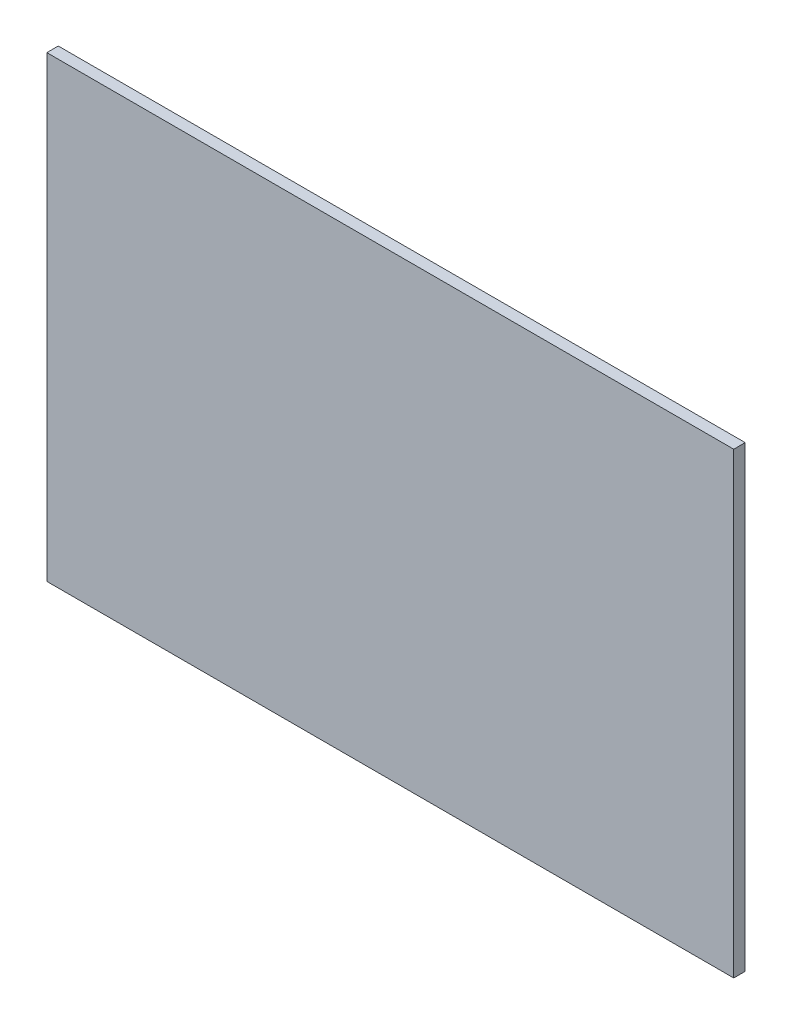
ISO-10303-21;
HEADER;
FILE_DESCRIPTION(('STEP AP214'),'2;1');
FILE_NAME('part.step','',(''),(''),'','','');
FILE_SCHEMA(('AUTOMOTIVE_DESIGN { 1 0 10303 214 1 1 1 1 }'));
ENDSEC;
DATA;
#1=APPLICATION_CONTEXT('core data for automotive mechanical design processes');
#2=APPLICATION_PROTOCOL_DEFINITION('international standard','automotive_design',2000,#1);
#3=PRODUCT_CONTEXT('',#1,'mechanical');
#4=PRODUCT('Part','Part','',(#3));
#5=PRODUCT_RELATED_PRODUCT_CATEGORY('part','',(#4));
#6=PRODUCT_DEFINITION_FORMATION('','',#4);
#7=PRODUCT_DEFINITION_CONTEXT('part definition',#1,'design');
#8=PRODUCT_DEFINITION('design','',#6,#7);
#9=PRODUCT_DEFINITION_SHAPE('','',#8);
#10=(LENGTH_UNIT() NAMED_UNIT(*) SI_UNIT(.MILLI.,.METRE.));
#11=(NAMED_UNIT(*) PLANE_ANGLE_UNIT() SI_UNIT($,.RADIAN.));
#12=(NAMED_UNIT(*) SI_UNIT($,.STERADIAN.) SOLID_ANGLE_UNIT());
#13=UNCERTAINTY_MEASURE_WITH_UNIT(LENGTH_MEASURE(1.E-05),#10,'distance_accuracy_value','');
#14=(GEOMETRIC_REPRESENTATION_CONTEXT(3) GLOBAL_UNCERTAINTY_ASSIGNED_CONTEXT((#13)) GLOBAL_UNIT_ASSIGNED_CONTEXT((#10,
#11,#12)) REPRESENTATION_CONTEXT('',''));
#15=CARTESIAN_POINT('',(0.,0.,0.));
#16=DIRECTION('',(0.,0.,1.));
#17=DIRECTION('',(1.,0.,0.));
#18=AXIS2_PLACEMENT_3D('',#15,#16,#17);
#19=CARTESIAN_POINT('',(0.,0.,10.));
#20=DIRECTION('',(0.,1.,0.));
#21=DIRECTION('',(0.,0.,1.));
#22=AXIS2_PLACEMENT_3D('',#19,#20,#21);
#23=PLANE('',#22);
#24=DIRECTION('',(1.,0.,0.));
#25=VECTOR('',#24,1.);
#26=CARTESIAN_POINT('',(0.,0.,0.));
#27=LINE('',#26,#25);
#28=CARTESIAN_POINT('',(0.,0.,0.));
#29=VERTEX_POINT('',#28);
#30=CARTESIAN_POINT('',(600.,0.,0.));
#31=VERTEX_POINT('',#30);
#32=EDGE_CURVE('E111',#29,#31,#27,.T.);
#33=ORIENTED_EDGE('',*,*,#32,.T.);
#34=DIRECTION('',(0.,0.,-1.));
#35=VECTOR('',#34,1.);
#36=CARTESIAN_POINT('',(600.,0.,10.));
#37=LINE('',#36,#35);
#38=CARTESIAN_POINT('',(600.,0.,10.));
#39=VERTEX_POINT('',#38);
#40=EDGE_CURVE('E11',#39,#31,#37,.T.);
#41=ORIENTED_EDGE('',*,*,#40,.F.);
#42=DIRECTION('',(1.,0.,0.));
#43=VECTOR('',#42,1.);
#44=CARTESIAN_POINT('',(0.,0.,10.));
#45=LINE('',#44,#43);
#46=CARTESIAN_POINT('',(0.,0.,10.));
#47=VERTEX_POINT('',#46);
#48=EDGE_CURVE('E93',#47,#39,#45,.T.);
#49=ORIENTED_EDGE('',*,*,#48,.F.);
#50=DIRECTION('',(0.,0.,-1.));
#51=VECTOR('',#50,1.);
#52=CARTESIAN_POINT('',(0.,0.,10.));
#53=LINE('',#52,#51);
#54=EDGE_CURVE('E60',#47,#29,#53,.T.);
#55=ORIENTED_EDGE('',*,*,#54,.T.);
#56=EDGE_LOOP('',(#33,#41,#49,#55));
#57=FACE_BOUND('',#56,.T.);
#58=ADVANCED_FACE('F43',(#57),#23,.F.);
#59=CARTESIAN_POINT('',(600.,0.,10.));
#60=DIRECTION('',(-1.,0.,0.));
#61=DIRECTION('',(0.,0.,1.));
#62=AXIS2_PLACEMENT_3D('',#59,#60,#61);
#63=PLANE('',#62);
#64=DIRECTION('',(0.,1.,0.));
#65=VECTOR('',#64,1.);
#66=CARTESIAN_POINT('',(600.,0.,0.));
#67=LINE('',#66,#65);
#68=CARTESIAN_POINT('',(600.,400.,0.));
#69=VERTEX_POINT('',#68);
#70=EDGE_CURVE('E99',#31,#69,#67,.T.);
#71=ORIENTED_EDGE('',*,*,#70,.T.);
#72=DIRECTION('',(0.,0.,-1.));
#73=VECTOR('',#72,1.);
#74=CARTESIAN_POINT('',(600.,400.,10.));
#75=LINE('',#74,#73);
#76=CARTESIAN_POINT('',(600.,400.,10.));
#77=VERTEX_POINT('',#76);
#78=EDGE_CURVE('E52',#77,#69,#75,.T.);
#79=ORIENTED_EDGE('',*,*,#78,.F.);
#80=DIRECTION('',(0.,1.,0.));
#81=VECTOR('',#80,1.);
#82=CARTESIAN_POINT('',(600.,0.,10.));
#83=LINE('',#82,#81);
#84=EDGE_CURVE('E85',#39,#77,#83,.T.);
#85=ORIENTED_EDGE('',*,*,#84,.F.);
#86=ORIENTED_EDGE('',*,*,#40,.T.);
#87=EDGE_LOOP('',(#71,#79,#85,#86));
#88=FACE_BOUND('',#87,.T.);
#89=ADVANCED_FACE('F98',(#88),#63,.F.);
#90=CARTESIAN_POINT('',(0.,400.,10.));
#91=DIRECTION('',(0.,1.,0.));
#92=DIRECTION('',(0.,0.,1.));
#93=AXIS2_PLACEMENT_3D('',#90,#91,#92);
#94=PLANE('',#93);
#95=DIRECTION('',(1.,0.,0.));
#96=VECTOR('',#95,1.);
#97=CARTESIAN_POINT('',(0.,400.,0.));
#98=LINE('',#97,#96);
#99=CARTESIAN_POINT('',(0.,400.,0.));
#100=VERTEX_POINT('',#99);
#101=EDGE_CURVE('E116',#100,#69,#98,.T.);
#102=ORIENTED_EDGE('',*,*,#101,.F.);
#103=DIRECTION('',(0.,0.,-1.));
#104=VECTOR('',#103,1.);
#105=CARTESIAN_POINT('',(0.,400.,10.));
#106=LINE('',#105,#104);
#107=CARTESIAN_POINT('',(0.,400.,10.));
#108=VERTEX_POINT('',#107);
#109=EDGE_CURVE('E74',#108,#100,#106,.T.);
#110=ORIENTED_EDGE('',*,*,#109,.F.);
#111=DIRECTION('',(1.,0.,0.));
#112=VECTOR('',#111,1.);
#113=CARTESIAN_POINT('',(0.,400.,10.));
#114=LINE('',#113,#112);
#115=EDGE_CURVE('E92',#108,#77,#114,.T.);
#116=ORIENTED_EDGE('',*,*,#115,.T.);
#117=ORIENTED_EDGE('',*,*,#78,.T.);
#118=EDGE_LOOP('',(#102,#110,#116,#117));
#119=FACE_BOUND('',#118,.T.);
#120=ADVANCED_FACE('F103',(#119),#94,.T.);
#121=CARTESIAN_POINT('',(0.,0.,10.));
#122=DIRECTION('',(-1.,0.,0.));
#123=DIRECTION('',(0.,0.,1.));
#124=AXIS2_PLACEMENT_3D('',#121,#122,#123);
#125=PLANE('',#124);
#126=DIRECTION('',(0.,1.,0.));
#127=VECTOR('',#126,1.);
#128=CARTESIAN_POINT('',(0.,0.,0.));
#129=LINE('',#128,#127);
#130=EDGE_CURVE('E119',#29,#100,#129,.T.);
#131=ORIENTED_EDGE('',*,*,#130,.F.);
#132=ORIENTED_EDGE('',*,*,#54,.F.);
#133=DIRECTION('',(0.,1.,0.));
#134=VECTOR('',#133,1.);
#135=CARTESIAN_POINT('',(0.,0.,10.));
#136=LINE('',#135,#134);
#137=EDGE_CURVE('E105',#47,#108,#136,.T.);
#138=ORIENTED_EDGE('',*,*,#137,.T.);
#139=ORIENTED_EDGE('',*,*,#109,.T.);
#140=EDGE_LOOP('',(#131,#132,#138,#139));
#141=FACE_BOUND('',#140,.T.);
#142=ADVANCED_FACE('F129',(#141),#125,.T.);
#143=CARTESIAN_POINT('',(0.,0.,10.));
#144=DIRECTION('',(0.,0.,1.));
#145=DIRECTION('',(1.,0.,0.));
#146=AXIS2_PLACEMENT_3D('',#143,#144,#145);
#147=PLANE('',#146);
#148=ORIENTED_EDGE('',*,*,#48,.T.);
#149=ORIENTED_EDGE('',*,*,#84,.T.);
#150=ORIENTED_EDGE('',*,*,#115,.F.);
#151=ORIENTED_EDGE('',*,*,#137,.F.);
#152=EDGE_LOOP('',(#148,#149,#150,#151));
#153=FACE_BOUND('',#152,.T.);
#154=ADVANCED_FACE('F89',(#153),#147,.T.);
#155=CARTESIAN_POINT('',(0.,0.,0.));
#156=DIRECTION('',(0.,0.,1.));
#157=DIRECTION('',(1.,0.,0.));
#158=AXIS2_PLACEMENT_3D('',#155,#156,#157);
#159=PLANE('',#158);
#160=ORIENTED_EDGE('',*,*,#32,.F.);
#161=ORIENTED_EDGE('',*,*,#130,.T.);
#162=ORIENTED_EDGE('',*,*,#101,.T.);
#163=ORIENTED_EDGE('',*,*,#70,.F.);
#164=EDGE_LOOP('',(#160,#161,#162,#163));
#165=FACE_BOUND('',#164,.T.);
#166=ADVANCED_FACE('F128',(#165),#159,.F.);
#167=CLOSED_SHELL('',(#58,#89,#120,#142,#154,#166));
#168=MANIFOLD_SOLID_BREP('B2',#167);
#169=ADVANCED_BREP_SHAPE_REPRESENTATION('',(#18,#168),#14);
#170=SHAPE_DEFINITION_REPRESENTATION(#9,#169);
ENDSEC;
END-ISO-10303-21;
